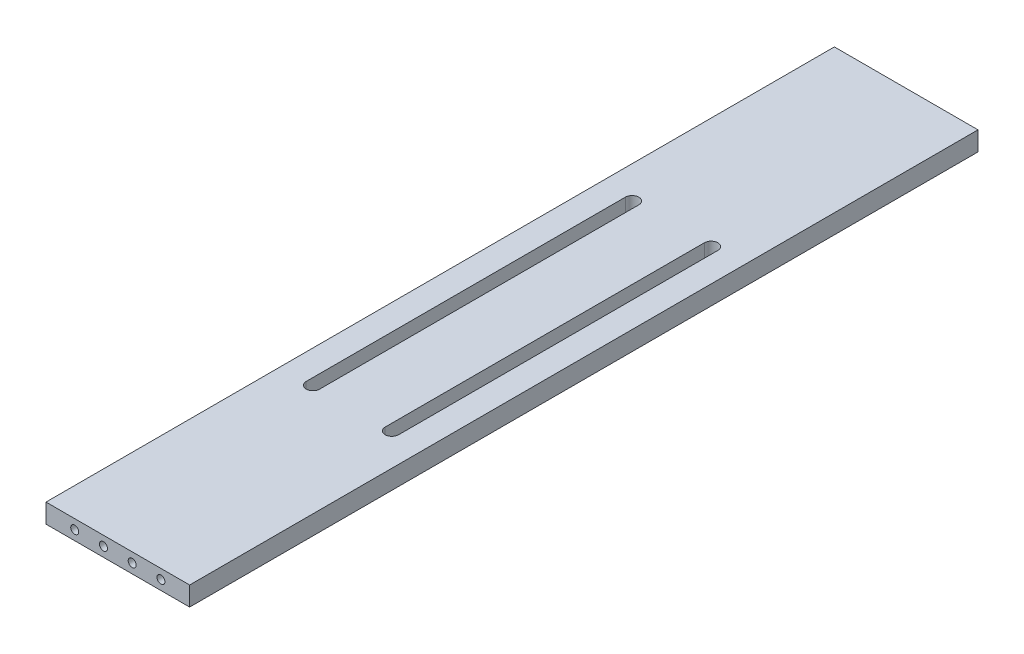
ISO-10303-21;
HEADER;
FILE_DESCRIPTION(('STEP AP214'),'2;1');
FILE_NAME('part.step','',(''),(''),'','','');
FILE_SCHEMA(('AUTOMOTIVE_DESIGN { 1 0 10303 214 1 1 1 1 }'));
ENDSEC;
DATA;
#1=APPLICATION_CONTEXT('core data for automotive mechanical design processes');
#2=APPLICATION_PROTOCOL_DEFINITION('international standard','automotive_design',2000,#1);
#3=PRODUCT_CONTEXT('',#1,'mechanical');
#4=PRODUCT('Part','Part','',(#3));
#5=PRODUCT_RELATED_PRODUCT_CATEGORY('part','',(#4));
#6=PRODUCT_DEFINITION_FORMATION('','',#4);
#7=PRODUCT_DEFINITION_CONTEXT('part definition',#1,'design');
#8=PRODUCT_DEFINITION('design','',#6,#7);
#9=PRODUCT_DEFINITION_SHAPE('','',#8);
#10=(LENGTH_UNIT() NAMED_UNIT(*) SI_UNIT(.MILLI.,.METRE.));
#11=(NAMED_UNIT(*) PLANE_ANGLE_UNIT() SI_UNIT($,.RADIAN.));
#12=(NAMED_UNIT(*) SI_UNIT($,.STERADIAN.) SOLID_ANGLE_UNIT());
#13=UNCERTAINTY_MEASURE_WITH_UNIT(LENGTH_MEASURE(1.E-05),#10,'distance_accuracy_value','');
#14=(GEOMETRIC_REPRESENTATION_CONTEXT(3) GLOBAL_UNCERTAINTY_ASSIGNED_CONTEXT((#13)) GLOBAL_UNIT_ASSIGNED_CONTEXT((#10,
#11,#12)) REPRESENTATION_CONTEXT('',''));
#15=CARTESIAN_POINT('',(0.,0.,0.));
#16=DIRECTION('',(0.,0.,1.));
#17=DIRECTION('',(1.,0.,0.));
#18=AXIS2_PLACEMENT_3D('',#15,#16,#17);
#19=CARTESIAN_POINT('',(-22.5,6.,0.));
#20=DIRECTION('',(0.,0.,1.));
#21=DIRECTION('',(1.,0.,0.));
#22=AXIS2_PLACEMENT_3D('',#19,#20,#21);
#23=PLANE('',#22);
#24=CARTESIAN_POINT('',(13.5000000000001,2.99999999999998,0.));
#25=DIRECTION('',(0.,0.,-1.));
#26=DIRECTION('',(-1.,0.,0.));
#27=AXIS2_PLACEMENT_3D('',#24,#25,#26);
#28=CIRCLE('',#27,1.24999999999999);
#29=CARTESIAN_POINT('',(12.2500000000001,2.99999999999998,0.));
#30=VERTEX_POINT('',#29);
#31=EDGE_CURVE('E162',#30,#30,#28,.T.);
#32=ORIENTED_EDGE('',*,*,#31,.F.);
#33=EDGE_LOOP('',(#32));
#34=FACE_BOUND('',#33,.T.);
#35=CARTESIAN_POINT('',(4.50000000000006,2.99999999999998,0.));
#36=DIRECTION('',(0.,0.,-1.));
#37=DIRECTION('',(-1.,0.,0.));
#38=AXIS2_PLACEMENT_3D('',#35,#36,#37);
#39=CIRCLE('',#38,1.24999999999999);
#40=CARTESIAN_POINT('',(3.25000000000007,2.99999999999998,0.));
#41=VERTEX_POINT('',#40);
#42=EDGE_CURVE('E161',#41,#41,#39,.T.);
#43=ORIENTED_EDGE('',*,*,#42,.F.);
#44=EDGE_LOOP('',(#43));
#45=FACE_BOUND('',#44,.T.);
#46=CARTESIAN_POINT('',(-4.49999999999993,2.99999999999999,0.));
#47=DIRECTION('',(0.,0.,-1.));
#48=DIRECTION('',(-1.,0.,0.));
#49=AXIS2_PLACEMENT_3D('',#46,#47,#48);
#50=CIRCLE('',#49,1.24999999999999);
#51=CARTESIAN_POINT('',(-5.74999999999992,2.99999999999999,0.));
#52=VERTEX_POINT('',#51);
#53=EDGE_CURVE('E172',#52,#52,#50,.T.);
#54=ORIENTED_EDGE('',*,*,#53,.F.);
#55=EDGE_LOOP('',(#54));
#56=FACE_BOUND('',#55,.T.);
#57=CARTESIAN_POINT('',(-13.4999999999999,3.,0.));
#58=DIRECTION('',(0.,0.,-1.));
#59=DIRECTION('',(-1.,0.,0.));
#60=AXIS2_PLACEMENT_3D('',#57,#58,#59);
#61=CIRCLE('',#60,1.24999999999999);
#62=CARTESIAN_POINT('',(-14.7499999999999,3.,0.));
#63=VERTEX_POINT('',#62);
#64=EDGE_CURVE('E178',#63,#63,#61,.T.);
#65=ORIENTED_EDGE('',*,*,#64,.F.);
#66=EDGE_LOOP('',(#65));
#67=FACE_BOUND('',#66,.T.);
#68=DIRECTION('',(-1.,0.,0.));
#69=VECTOR('',#68,1.);
#70=CARTESIAN_POINT('',(-22.5,0.,0.));
#71=LINE('',#70,#69);
#72=CARTESIAN_POINT('',(22.5,0.,0.));
#73=VERTEX_POINT('',#72);
#74=CARTESIAN_POINT('',(-22.5,0.,0.));
#75=VERTEX_POINT('',#74);
#76=EDGE_CURVE('E262',#73,#75,#71,.T.);
#77=ORIENTED_EDGE('',*,*,#76,.T.);
#78=DIRECTION('',(0.,-1.,0.));
#79=VECTOR('',#78,1.);
#80=CARTESIAN_POINT('',(-22.5,6.,0.));
#81=LINE('',#80,#79);
#82=CARTESIAN_POINT('',(-22.5,6.,0.));
#83=VERTEX_POINT('',#82);
#84=EDGE_CURVE('E11',#83,#75,#81,.T.);
#85=ORIENTED_EDGE('',*,*,#84,.F.);
#86=DIRECTION('',(-1.,0.,0.));
#87=VECTOR('',#86,1.);
#88=CARTESIAN_POINT('',(-22.5,6.,0.));
#89=LINE('',#88,#87);
#90=CARTESIAN_POINT('',(22.5,6.,0.));
#91=VERTEX_POINT('',#90);
#92=EDGE_CURVE('E269',#91,#83,#89,.T.);
#93=ORIENTED_EDGE('',*,*,#92,.F.);
#94=DIRECTION('',(0.,-1.,0.));
#95=VECTOR('',#94,1.);
#96=CARTESIAN_POINT('',(22.5,6.,0.));
#97=LINE('',#96,#95);
#98=EDGE_CURVE('E279',#91,#73,#97,.T.);
#99=ORIENTED_EDGE('',*,*,#98,.T.);
#100=EDGE_LOOP('',(#77,#85,#93,#99));
#101=FACE_BOUND('',#100,.T.);
#102=ADVANCED_FACE('F41',(#34,#45,#56,#67,#101),#23,.F.);
#103=CARTESIAN_POINT('',(-22.5,6.,0.));
#104=DIRECTION('',(1.,0.,0.));
#105=DIRECTION('',(0.,0.,-1.));
#106=AXIS2_PLACEMENT_3D('',#103,#104,#105);
#107=PLANE('',#106);
#108=DIRECTION('',(0.,0.,1.));
#109=VECTOR('',#108,1.);
#110=CARTESIAN_POINT('',(-22.5,0.,0.));
#111=LINE('',#110,#109);
#112=CARTESIAN_POINT('',(-22.5,0.,247.));
#113=VERTEX_POINT('',#112);
#114=EDGE_CURVE('E282',#75,#113,#111,.T.);
#115=ORIENTED_EDGE('',*,*,#114,.T.);
#116=DIRECTION('',(0.,-1.,0.));
#117=VECTOR('',#116,1.);
#118=CARTESIAN_POINT('',(-22.5,6.,247.));
#119=LINE('',#118,#117);
#120=CARTESIAN_POINT('',(-22.5,6.,247.));
#121=VERTEX_POINT('',#120);
#122=EDGE_CURVE('E48',#121,#113,#119,.T.);
#123=ORIENTED_EDGE('',*,*,#122,.F.);
#124=DIRECTION('',(0.,0.,1.));
#125=VECTOR('',#124,1.);
#126=CARTESIAN_POINT('',(-22.5,6.,0.));
#127=LINE('',#126,#125);
#128=EDGE_CURVE('E272',#83,#121,#127,.T.);
#129=ORIENTED_EDGE('',*,*,#128,.F.);
#130=ORIENTED_EDGE('',*,*,#84,.T.);
#131=EDGE_LOOP('',(#115,#123,#129,#130));
#132=FACE_BOUND('',#131,.T.);
#133=ADVANCED_FACE('F312',(#132),#107,.F.);
#134=CARTESIAN_POINT('',(-22.5,6.,247.));
#135=DIRECTION('',(0.,0.,-1.));
#136=DIRECTION('',(-1.,0.,0.));
#137=AXIS2_PLACEMENT_3D('',#134,#135,#136);
#138=PLANE('',#137);
#139=CARTESIAN_POINT('',(-13.5,3.,247.));
#140=DIRECTION('',(0.,0.,1.));
#141=DIRECTION('',(1.,0.,0.));
#142=AXIS2_PLACEMENT_3D('',#139,#140,#141);
#143=CIRCLE('',#142,1.24999999999999);
#144=CARTESIAN_POINT('',(-12.25,3.,247.));
#145=VERTEX_POINT('',#144);
#146=EDGE_CURVE('E184',#145,#145,#143,.T.);
#147=ORIENTED_EDGE('',*,*,#146,.F.);
#148=EDGE_LOOP('',(#147));
#149=FACE_BOUND('',#148,.T.);
#150=CARTESIAN_POINT('',(-4.49999999999996,2.99999999999999,247.));
#151=DIRECTION('',(0.,0.,1.));
#152=DIRECTION('',(1.,0.,0.));
#153=AXIS2_PLACEMENT_3D('',#150,#151,#152);
#154=CIRCLE('',#153,1.24999999999999);
#155=CARTESIAN_POINT('',(-3.24999999999997,2.99999999999999,247.));
#156=VERTEX_POINT('',#155);
#157=EDGE_CURVE('E190',#156,#156,#154,.T.);
#158=ORIENTED_EDGE('',*,*,#157,.F.);
#159=EDGE_LOOP('',(#158));
#160=FACE_BOUND('',#159,.T.);
#161=CARTESIAN_POINT('',(4.50000000000003,2.99999999999998,247.));
#162=DIRECTION('',(0.,0.,1.));
#163=DIRECTION('',(1.,0.,0.));
#164=AXIS2_PLACEMENT_3D('',#161,#162,#163);
#165=CIRCLE('',#164,1.24999999999999);
#166=CARTESIAN_POINT('',(5.75000000000002,2.99999999999998,247.));
#167=VERTEX_POINT('',#166);
#168=EDGE_CURVE('E196',#167,#167,#165,.T.);
#169=ORIENTED_EDGE('',*,*,#168,.F.);
#170=EDGE_LOOP('',(#169));
#171=FACE_BOUND('',#170,.T.);
#172=CARTESIAN_POINT('',(13.5,2.99999999999998,247.));
#173=DIRECTION('',(0.,0.,1.));
#174=DIRECTION('',(1.,0.,0.));
#175=AXIS2_PLACEMENT_3D('',#172,#173,#174);
#176=CIRCLE('',#175,1.24999999999999);
#177=CARTESIAN_POINT('',(14.75,2.99999999999998,247.));
#178=VERTEX_POINT('',#177);
#179=EDGE_CURVE('E202',#178,#178,#176,.T.);
#180=ORIENTED_EDGE('',*,*,#179,.F.);
#181=EDGE_LOOP('',(#180));
#182=FACE_BOUND('',#181,.T.);
#183=DIRECTION('',(1.,0.,0.));
#184=VECTOR('',#183,1.);
#185=CARTESIAN_POINT('',(-22.5,0.,247.));
#186=LINE('',#185,#184);
#187=CARTESIAN_POINT('',(22.5,0.,247.));
#188=VERTEX_POINT('',#187);
#189=EDGE_CURVE('E284',#113,#188,#186,.T.);
#190=ORIENTED_EDGE('',*,*,#189,.T.);
#191=DIRECTION('',(0.,-1.,0.));
#192=VECTOR('',#191,1.);
#193=CARTESIAN_POINT('',(22.5,6.,247.));
#194=LINE('',#193,#192);
#195=CARTESIAN_POINT('',(22.5,6.,247.));
#196=VERTEX_POINT('',#195);
#197=EDGE_CURVE('E289',#196,#188,#194,.T.);
#198=ORIENTED_EDGE('',*,*,#197,.F.);
#199=DIRECTION('',(1.,0.,0.));
#200=VECTOR('',#199,1.);
#201=CARTESIAN_POINT('',(-22.5,6.,247.));
#202=LINE('',#201,#200);
#203=EDGE_CURVE('E275',#121,#196,#202,.T.);
#204=ORIENTED_EDGE('',*,*,#203,.F.);
#205=ORIENTED_EDGE('',*,*,#122,.T.);
#206=EDGE_LOOP('',(#190,#198,#204,#205));
#207=FACE_BOUND('',#206,.T.);
#208=ADVANCED_FACE('F296',(#149,#160,#171,#182,#207),#138,.F.);
#209=CARTESIAN_POINT('',(22.5,6.,0.));
#210=DIRECTION('',(-1.,0.,0.));
#211=DIRECTION('',(0.,0.,1.));
#212=AXIS2_PLACEMENT_3D('',#209,#210,#211);
#213=PLANE('',#212);
#214=DIRECTION('',(0.,0.,-1.));
#215=VECTOR('',#214,1.);
#216=CARTESIAN_POINT('',(22.5,0.,0.));
#217=LINE('',#216,#215);
#218=EDGE_CURVE('E273',#188,#73,#217,.T.);
#219=ORIENTED_EDGE('',*,*,#218,.T.);
#220=ORIENTED_EDGE('',*,*,#98,.F.);
#221=DIRECTION('',(0.,0.,-1.));
#222=VECTOR('',#221,1.);
#223=CARTESIAN_POINT('',(22.5,6.,0.));
#224=LINE('',#223,#222);
#225=EDGE_CURVE('E277',#196,#91,#224,.T.);
#226=ORIENTED_EDGE('',*,*,#225,.F.);
#227=ORIENTED_EDGE('',*,*,#197,.T.);
#228=EDGE_LOOP('',(#219,#220,#226,#227));
#229=FACE_BOUND('',#228,.T.);
#230=ADVANCED_FACE('F305',(#229),#213,.F.);
#231=CARTESIAN_POINT('',(0.,6.,0.));
#232=DIRECTION('',(0.,-1.,0.));
#233=DIRECTION('',(0.,0.,-1.));
#234=AXIS2_PLACEMENT_3D('',#231,#232,#233);
#235=PLANE('',#234);
#236=DIRECTION('',(0.,0.,1.));
#237=VECTOR('',#236,1.);
#238=CARTESIAN_POINT('',(-14.4743686707646,6.,73.5));
#239=LINE('',#238,#237);
#240=CARTESIAN_POINT('',(-14.4743686707646,6.,73.5));
#241=VERTEX_POINT('',#240);
#242=CARTESIAN_POINT('',(-14.4743686707646,6.,173.5));
#243=VERTEX_POINT('',#242);
#244=EDGE_CURVE('E221',#241,#243,#239,.T.);
#245=ORIENTED_EDGE('',*,*,#244,.F.);
#246=CARTESIAN_POINT('',(-12.3743686707645,6.,73.5));
#247=DIRECTION('',(0.,1.,0.));
#248=DIRECTION('',(0.,0.,1.));
#249=AXIS2_PLACEMENT_3D('',#246,#247,#248);
#250=CIRCLE('',#249,2.10000000000002);
#251=CARTESIAN_POINT('',(-10.2743686707645,6.,73.5));
#252=VERTEX_POINT('',#251);
#253=EDGE_CURVE('E55',#252,#241,#250,.T.);
#254=ORIENTED_EDGE('',*,*,#253,.F.);
#255=DIRECTION('',(0.,0.,-1.));
#256=VECTOR('',#255,1.);
#257=CARTESIAN_POINT('',(-10.2743686707645,6.,73.5));
#258=LINE('',#257,#256);
#259=CARTESIAN_POINT('',(-10.2743686707645,6.,173.5));
#260=VERTEX_POINT('',#259);
#261=EDGE_CURVE('E212',#260,#252,#258,.T.);
#262=ORIENTED_EDGE('',*,*,#261,.F.);
#263=CARTESIAN_POINT('',(-12.3743686707645,6.,173.5));
#264=DIRECTION('',(0.,1.,0.));
#265=DIRECTION('',(0.,0.,1.));
#266=AXIS2_PLACEMENT_3D('',#263,#264,#265);
#267=CIRCLE('',#266,2.10000000000002);
#268=EDGE_CURVE('E224',#243,#260,#267,.T.);
#269=ORIENTED_EDGE('',*,*,#268,.F.);
#270=EDGE_LOOP('',(#245,#254,#262,#269));
#271=FACE_BOUND('',#270,.T.);
#272=DIRECTION('',(0.,0.,1.));
#273=VECTOR('',#272,1.);
#274=CARTESIAN_POINT('',(10.2743686707645,6.,73.5));
#275=LINE('',#274,#273);
#276=CARTESIAN_POINT('',(10.2743686707645,6.,73.5));
#277=VERTEX_POINT('',#276);
#278=CARTESIAN_POINT('',(10.2743686707646,6.,173.5));
#279=VERTEX_POINT('',#278);
#280=EDGE_CURVE('E252',#277,#279,#275,.T.);
#281=ORIENTED_EDGE('',*,*,#280,.F.);
#282=CARTESIAN_POINT('',(12.3743686707646,6.,73.5));
#283=DIRECTION('',(0.,1.,0.));
#284=DIRECTION('',(0.,0.,-1.));
#285=AXIS2_PLACEMENT_3D('',#282,#283,#284);
#286=CIRCLE('',#285,2.10000000000002);
#287=CARTESIAN_POINT('',(14.4743686707646,6.,73.5));
#288=VERTEX_POINT('',#287);
#289=EDGE_CURVE('E231',#288,#277,#286,.T.);
#290=ORIENTED_EDGE('',*,*,#289,.F.);
#291=DIRECTION('',(0.,0.,-1.));
#292=VECTOR('',#291,1.);
#293=CARTESIAN_POINT('',(14.4743686707646,6.,73.5));
#294=LINE('',#293,#292);
#295=CARTESIAN_POINT('',(14.4743686707646,6.,173.5));
#296=VERTEX_POINT('',#295);
#297=EDGE_CURVE('E241',#296,#288,#294,.T.);
#298=ORIENTED_EDGE('',*,*,#297,.F.);
#299=CARTESIAN_POINT('',(12.3743686707646,6.,173.5));
#300=DIRECTION('',(0.,1.,0.));
#301=DIRECTION('',(0.,0.,-1.));
#302=AXIS2_PLACEMENT_3D('',#299,#300,#301);
#303=CIRCLE('',#302,2.10000000000002);
#304=EDGE_CURVE('E255',#279,#296,#303,.T.);
#305=ORIENTED_EDGE('',*,*,#304,.F.);
#306=EDGE_LOOP('',(#281,#290,#298,#305));
#307=FACE_BOUND('',#306,.T.);
#308=ORIENTED_EDGE('',*,*,#92,.T.);
#309=ORIENTED_EDGE('',*,*,#128,.T.);
#310=ORIENTED_EDGE('',*,*,#203,.T.);
#311=ORIENTED_EDGE('',*,*,#225,.T.);
#312=EDGE_LOOP('',(#308,#309,#310,#311));
#313=FACE_BOUND('',#312,.T.);
#314=ADVANCED_FACE('F311',(#271,#307,#313),#235,.F.);
#315=CARTESIAN_POINT('',(0.,0.,0.));
#316=DIRECTION('',(0.,-1.,0.));
#317=DIRECTION('',(0.,0.,-1.));
#318=AXIS2_PLACEMENT_3D('',#315,#316,#317);
#319=PLANE('',#318);
#320=CARTESIAN_POINT('',(-12.3743686707645,0.,73.5));
#321=DIRECTION('',(0.,1.,0.));
#322=DIRECTION('',(0.,0.,1.));
#323=AXIS2_PLACEMENT_3D('',#320,#321,#322);
#324=CIRCLE('',#323,2.10000000000002);
#325=CARTESIAN_POINT('',(-10.2743686707645,0.,73.5));
#326=VERTEX_POINT('',#325);
#327=CARTESIAN_POINT('',(-14.4743686707646,0.,73.5));
#328=VERTEX_POINT('',#327);
#329=EDGE_CURVE('E208',#326,#328,#324,.T.);
#330=ORIENTED_EDGE('',*,*,#329,.T.);
#331=DIRECTION('',(0.,0.,1.));
#332=VECTOR('',#331,1.);
#333=CARTESIAN_POINT('',(-14.4743686707646,0.,73.5));
#334=LINE('',#333,#332);
#335=CARTESIAN_POINT('',(-14.4743686707646,0.,173.5));
#336=VERTEX_POINT('',#335);
#337=EDGE_CURVE('E211',#328,#336,#334,.T.);
#338=ORIENTED_EDGE('',*,*,#337,.T.);
#339=CARTESIAN_POINT('',(-12.3743686707645,0.,173.5));
#340=DIRECTION('',(0.,1.,0.));
#341=DIRECTION('',(0.,0.,1.));
#342=AXIS2_PLACEMENT_3D('',#339,#340,#341);
#343=CIRCLE('',#342,2.10000000000002);
#344=CARTESIAN_POINT('',(-10.2743686707645,0.,173.5));
#345=VERTEX_POINT('',#344);
#346=EDGE_CURVE('E63',#336,#345,#343,.T.);
#347=ORIENTED_EDGE('',*,*,#346,.T.);
#348=DIRECTION('',(0.,0.,-1.));
#349=VECTOR('',#348,1.);
#350=CARTESIAN_POINT('',(-10.2743686707645,0.,73.5));
#351=LINE('',#350,#349);
#352=EDGE_CURVE('E216',#345,#326,#351,.T.);
#353=ORIENTED_EDGE('',*,*,#352,.T.);
#354=EDGE_LOOP('',(#330,#338,#347,#353));
#355=FACE_BOUND('',#354,.T.);
#356=CARTESIAN_POINT('',(12.3743686707646,0.,73.5));
#357=DIRECTION('',(0.,1.,0.));
#358=DIRECTION('',(0.,0.,-1.));
#359=AXIS2_PLACEMENT_3D('',#356,#357,#358);
#360=CIRCLE('',#359,2.10000000000002);
#361=CARTESIAN_POINT('',(14.4743686707646,0.,73.5));
#362=VERTEX_POINT('',#361);
#363=CARTESIAN_POINT('',(10.2743686707645,0.,73.5));
#364=VERTEX_POINT('',#363);
#365=EDGE_CURVE('E237',#362,#364,#360,.T.);
#366=ORIENTED_EDGE('',*,*,#365,.T.);
#367=DIRECTION('',(0.,0.,1.));
#368=VECTOR('',#367,1.);
#369=CARTESIAN_POINT('',(10.2743686707645,0.,73.5));
#370=LINE('',#369,#368);
#371=CARTESIAN_POINT('',(10.2743686707646,0.,173.5));
#372=VERTEX_POINT('',#371);
#373=EDGE_CURVE('E240',#364,#372,#370,.T.);
#374=ORIENTED_EDGE('',*,*,#373,.T.);
#375=CARTESIAN_POINT('',(12.3743686707646,0.,173.5));
#376=DIRECTION('',(0.,1.,0.));
#377=DIRECTION('',(0.,0.,-1.));
#378=AXIS2_PLACEMENT_3D('',#375,#376,#377);
#379=CIRCLE('',#378,2.10000000000002);
#380=CARTESIAN_POINT('',(14.4743686707646,0.,173.5));
#381=VERTEX_POINT('',#380);
#382=EDGE_CURVE('E244',#372,#381,#379,.T.);
#383=ORIENTED_EDGE('',*,*,#382,.T.);
#384=DIRECTION('',(0.,0.,-1.));
#385=VECTOR('',#384,1.);
#386=CARTESIAN_POINT('',(14.4743686707646,0.,73.5));
#387=LINE('',#386,#385);
#388=EDGE_CURVE('E247',#381,#362,#387,.T.);
#389=ORIENTED_EDGE('',*,*,#388,.T.);
#390=EDGE_LOOP('',(#366,#374,#383,#389));
#391=FACE_BOUND('',#390,.T.);
#392=ORIENTED_EDGE('',*,*,#76,.F.);
#393=ORIENTED_EDGE('',*,*,#218,.F.);
#394=ORIENTED_EDGE('',*,*,#189,.F.);
#395=ORIENTED_EDGE('',*,*,#114,.F.);
#396=EDGE_LOOP('',(#392,#393,#394,#395));
#397=FACE_BOUND('',#396,.T.);
#398=ADVANCED_FACE('F302',(#355,#391,#397),#319,.T.);
#399=CARTESIAN_POINT('',(12.3743686707646,0.,73.5));
#400=DIRECTION('',(0.,1.,0.));
#401=DIRECTION('',(0.,0.,1.));
#402=AXIS2_PLACEMENT_3D('',#399,#400,#401);
#403=CYLINDRICAL_SURFACE('',#402,2.10000000000002);
#404=ORIENTED_EDGE('',*,*,#289,.T.);
#405=DIRECTION('',(0.,1.,0.));
#406=VECTOR('',#405,1.);
#407=CARTESIAN_POINT('',(10.2743686707645,0.,73.5));
#408=LINE('',#407,#406);
#409=EDGE_CURVE('E250',#364,#277,#408,.T.);
#410=ORIENTED_EDGE('',*,*,#409,.F.);
#411=ORIENTED_EDGE('',*,*,#365,.F.);
#412=DIRECTION('',(0.,1.,0.));
#413=VECTOR('',#412,1.);
#414=CARTESIAN_POINT('',(14.4743686707646,0.,73.5));
#415=LINE('',#414,#413);
#416=EDGE_CURVE('E260',#362,#288,#415,.T.);
#417=ORIENTED_EDGE('',*,*,#416,.T.);
#418=EDGE_LOOP('',(#404,#410,#411,#417));
#419=FACE_BOUND('',#418,.T.);
#420=ADVANCED_FACE('F326',(#419),#403,.F.);
#421=CARTESIAN_POINT('',(14.4743686707646,0.,73.5));
#422=DIRECTION('',(1.,0.,0.));
#423=DIRECTION('',(0.,0.,-1.));
#424=AXIS2_PLACEMENT_3D('',#421,#422,#423);
#425=PLANE('',#424);
#426=ORIENTED_EDGE('',*,*,#297,.T.);
#427=ORIENTED_EDGE('',*,*,#416,.F.);
#428=ORIENTED_EDGE('',*,*,#388,.F.);
#429=DIRECTION('',(0.,1.,0.));
#430=VECTOR('',#429,1.);
#431=CARTESIAN_POINT('',(14.4743686707646,0.,173.5));
#432=LINE('',#431,#430);
#433=EDGE_CURVE('E263',#381,#296,#432,.T.);
#434=ORIENTED_EDGE('',*,*,#433,.T.);
#435=EDGE_LOOP('',(#426,#427,#428,#434));
#436=FACE_BOUND('',#435,.T.);
#437=ADVANCED_FACE('F333',(#436),#425,.F.);
#438=CARTESIAN_POINT('',(12.3743686707646,0.,173.5));
#439=DIRECTION('',(0.,1.,0.));
#440=DIRECTION('',(0.,0.,1.));
#441=AXIS2_PLACEMENT_3D('',#438,#439,#440);
#442=CYLINDRICAL_SURFACE('',#441,2.10000000000002);
#443=ORIENTED_EDGE('',*,*,#304,.T.);
#444=ORIENTED_EDGE('',*,*,#433,.F.);
#445=ORIENTED_EDGE('',*,*,#382,.F.);
#446=DIRECTION('',(0.,1.,0.));
#447=VECTOR('',#446,1.);
#448=CARTESIAN_POINT('',(10.2743686707646,0.,173.5));
#449=LINE('',#448,#447);
#450=EDGE_CURVE('E265',#372,#279,#449,.T.);
#451=ORIENTED_EDGE('',*,*,#450,.T.);
#452=EDGE_LOOP('',(#443,#444,#445,#451));
#453=FACE_BOUND('',#452,.T.);
#454=ADVANCED_FACE('F339',(#453),#442,.F.);
#455=CARTESIAN_POINT('',(10.2743686707645,0.,73.5));
#456=DIRECTION('',(-1.,0.,0.));
#457=DIRECTION('',(0.,0.,1.));
#458=AXIS2_PLACEMENT_3D('',#455,#456,#457);
#459=PLANE('',#458);
#460=ORIENTED_EDGE('',*,*,#280,.T.);
#461=ORIENTED_EDGE('',*,*,#450,.F.);
#462=ORIENTED_EDGE('',*,*,#373,.F.);
#463=ORIENTED_EDGE('',*,*,#409,.T.);
#464=EDGE_LOOP('',(#460,#461,#462,#463));
#465=FACE_BOUND('',#464,.T.);
#466=ADVANCED_FACE('F335',(#465),#459,.F.);
#467=CARTESIAN_POINT('',(-12.3743686707645,0.,73.5));
#468=DIRECTION('',(0.,1.,0.));
#469=DIRECTION('',(0.,0.,1.));
#470=AXIS2_PLACEMENT_3D('',#467,#468,#469);
#471=CYLINDRICAL_SURFACE('',#470,2.10000000000002);
#472=ORIENTED_EDGE('',*,*,#253,.T.);
#473=DIRECTION('',(0.,1.,0.));
#474=VECTOR('',#473,1.);
#475=CARTESIAN_POINT('',(-14.4743686707646,0.,73.5));
#476=LINE('',#475,#474);
#477=EDGE_CURVE('E219',#328,#241,#476,.T.);
#478=ORIENTED_EDGE('',*,*,#477,.F.);
#479=ORIENTED_EDGE('',*,*,#329,.F.);
#480=DIRECTION('',(0.,1.,0.));
#481=VECTOR('',#480,1.);
#482=CARTESIAN_POINT('',(-10.2743686707645,0.,73.5));
#483=LINE('',#482,#481);
#484=EDGE_CURVE('E229',#326,#252,#483,.T.);
#485=ORIENTED_EDGE('',*,*,#484,.T.);
#486=EDGE_LOOP('',(#472,#478,#479,#485));
#487=FACE_BOUND('',#486,.T.);
#488=ADVANCED_FACE('F338',(#487),#471,.F.);
#489=CARTESIAN_POINT('',(-10.2743686707645,0.,73.5));
#490=DIRECTION('',(1.,0.,0.));
#491=DIRECTION('',(0.,0.,-1.));
#492=AXIS2_PLACEMENT_3D('',#489,#490,#491);
#493=PLANE('',#492);
#494=ORIENTED_EDGE('',*,*,#261,.T.);
#495=ORIENTED_EDGE('',*,*,#484,.F.);
#496=ORIENTED_EDGE('',*,*,#352,.F.);
#497=DIRECTION('',(0.,1.,0.));
#498=VECTOR('',#497,1.);
#499=CARTESIAN_POINT('',(-10.2743686707645,0.,173.5));
#500=LINE('',#499,#498);
#501=EDGE_CURVE('E232',#345,#260,#500,.T.);
#502=ORIENTED_EDGE('',*,*,#501,.T.);
#503=EDGE_LOOP('',(#494,#495,#496,#502));
#504=FACE_BOUND('',#503,.T.);
#505=ADVANCED_FACE('F349',(#504),#493,.F.);
#506=CARTESIAN_POINT('',(-12.3743686707645,0.,173.5));
#507=DIRECTION('',(0.,1.,0.));
#508=DIRECTION('',(0.,0.,1.));
#509=AXIS2_PLACEMENT_3D('',#506,#507,#508);
#510=CYLINDRICAL_SURFACE('',#509,2.10000000000002);
#511=ORIENTED_EDGE('',*,*,#268,.T.);
#512=ORIENTED_EDGE('',*,*,#501,.F.);
#513=ORIENTED_EDGE('',*,*,#346,.F.);
#514=DIRECTION('',(0.,1.,0.));
#515=VECTOR('',#514,1.);
#516=CARTESIAN_POINT('',(-14.4743686707646,0.,173.5));
#517=LINE('',#516,#515);
#518=EDGE_CURVE('E234',#336,#243,#517,.T.);
#519=ORIENTED_EDGE('',*,*,#518,.T.);
#520=EDGE_LOOP('',(#511,#512,#513,#519));
#521=FACE_BOUND('',#520,.T.);
#522=ADVANCED_FACE('F354',(#521),#510,.F.);
#523=CARTESIAN_POINT('',(-14.4743686707646,0.,73.5));
#524=DIRECTION('',(-1.,0.,0.));
#525=DIRECTION('',(0.,0.,1.));
#526=AXIS2_PLACEMENT_3D('',#523,#524,#525);
#527=PLANE('',#526);
#528=ORIENTED_EDGE('',*,*,#244,.T.);
#529=ORIENTED_EDGE('',*,*,#518,.F.);
#530=ORIENTED_EDGE('',*,*,#337,.F.);
#531=ORIENTED_EDGE('',*,*,#477,.T.);
#532=EDGE_LOOP('',(#528,#529,#530,#531));
#533=FACE_BOUND('',#532,.T.);
#534=ADVANCED_FACE('F350',(#533),#527,.F.);
#535=CARTESIAN_POINT('',(13.5,2.99999999999998,238.5));
#536=DIRECTION('',(0.,0.,1.));
#537=DIRECTION('',(1.,0.,0.));
#538=AXIS2_PLACEMENT_3D('',#535,#536,#537);
#539=CONICAL_SURFACE('',#538,1.24999999999999,1.02974425867665);
#540=CARTESIAN_POINT('',(13.5,2.99999999999998,237.748924226216));
#541=VERTEX_POINT('',#540);
#542=VERTEX_LOOP('',#541);
#543=FACE_BOUND('',#542,.T.);
#544=CARTESIAN_POINT('',(13.5,2.99999999999998,238.5));
#545=DIRECTION('',(0.,0.,1.));
#546=DIRECTION('',(1.,0.,0.));
#547=AXIS2_PLACEMENT_3D('',#544,#545,#546);
#548=CIRCLE('',#547,1.24999999999999);
#549=CARTESIAN_POINT('',(14.75,2.99999999999998,238.5));
#550=VERTEX_POINT('',#549);
#551=EDGE_CURVE('E205',#550,#550,#548,.T.);
#552=ORIENTED_EDGE('',*,*,#551,.T.);
#553=EDGE_LOOP('',(#552));
#554=FACE_BOUND('',#553,.T.);
#555=ADVANCED_FACE('F353',(#543,#554),#539,.F.);
#556=CARTESIAN_POINT('',(13.5,2.99999999999998,247.));
#557=DIRECTION('',(0.,0.,1.));
#558=DIRECTION('',(1.,0.,0.));
#559=AXIS2_PLACEMENT_3D('',#556,#557,#558);
#560=CYLINDRICAL_SURFACE('',#559,1.24999999999999);
#561=ORIENTED_EDGE('',*,*,#551,.F.);
#562=EDGE_LOOP('',(#561));
#563=FACE_BOUND('',#562,.T.);
#564=ORIENTED_EDGE('',*,*,#179,.T.);
#565=EDGE_LOOP('',(#564));
#566=FACE_BOUND('',#565,.T.);
#567=ADVANCED_FACE('F363',(#563,#566),#560,.F.);
#568=CARTESIAN_POINT('',(4.50000000000003,2.99999999999998,238.5));
#569=DIRECTION('',(0.,0.,1.));
#570=DIRECTION('',(1.,0.,0.));
#571=AXIS2_PLACEMENT_3D('',#568,#569,#570);
#572=CONICAL_SURFACE('',#571,1.24999999999999,1.02974425867665);
#573=CARTESIAN_POINT('',(4.50000000000003,2.99999999999998,237.748924226216));
#574=VERTEX_POINT('',#573);
#575=VERTEX_LOOP('',#574);
#576=FACE_BOUND('',#575,.T.);
#577=CARTESIAN_POINT('',(4.50000000000003,2.99999999999998,238.5));
#578=DIRECTION('',(0.,0.,1.));
#579=DIRECTION('',(1.,0.,0.));
#580=AXIS2_PLACEMENT_3D('',#577,#578,#579);
#581=CIRCLE('',#580,1.24999999999999);
#582=CARTESIAN_POINT('',(5.75000000000002,2.99999999999998,238.5));
#583=VERTEX_POINT('',#582);
#584=EDGE_CURVE('E199',#583,#583,#581,.T.);
#585=ORIENTED_EDGE('',*,*,#584,.T.);
#586=EDGE_LOOP('',(#585));
#587=FACE_BOUND('',#586,.T.);
#588=ADVANCED_FACE('F367',(#576,#587),#572,.F.);
#589=CARTESIAN_POINT('',(4.50000000000003,2.99999999999998,247.));
#590=DIRECTION('',(0.,0.,1.));
#591=DIRECTION('',(1.,0.,0.));
#592=AXIS2_PLACEMENT_3D('',#589,#590,#591);
#593=CYLINDRICAL_SURFACE('',#592,1.24999999999999);
#594=ORIENTED_EDGE('',*,*,#584,.F.);
#595=EDGE_LOOP('',(#594));
#596=FACE_BOUND('',#595,.T.);
#597=ORIENTED_EDGE('',*,*,#168,.T.);
#598=EDGE_LOOP('',(#597));
#599=FACE_BOUND('',#598,.T.);
#600=ADVANCED_FACE('F371',(#596,#599),#593,.F.);
#601=CARTESIAN_POINT('',(-4.49999999999996,2.99999999999999,238.5));
#602=DIRECTION('',(0.,0.,1.));
#603=DIRECTION('',(1.,0.,0.));
#604=AXIS2_PLACEMENT_3D('',#601,#602,#603);
#605=CONICAL_SURFACE('',#604,1.24999999999999,1.02974425867665);
#606=CARTESIAN_POINT('',(-4.49999999999997,2.99999999999999,237.748924226216));
#607=VERTEX_POINT('',#606);
#608=VERTEX_LOOP('',#607);
#609=FACE_BOUND('',#608,.T.);
#610=CARTESIAN_POINT('',(-4.49999999999996,2.99999999999999,238.5));
#611=DIRECTION('',(0.,0.,1.));
#612=DIRECTION('',(1.,0.,0.));
#613=AXIS2_PLACEMENT_3D('',#610,#611,#612);
#614=CIRCLE('',#613,1.24999999999999);
#615=CARTESIAN_POINT('',(-3.24999999999998,2.99999999999999,238.5));
#616=VERTEX_POINT('',#615);
#617=EDGE_CURVE('E193',#616,#616,#614,.T.);
#618=ORIENTED_EDGE('',*,*,#617,.T.);
#619=EDGE_LOOP('',(#618));
#620=FACE_BOUND('',#619,.T.);
#621=ADVANCED_FACE('F375',(#609,#620),#605,.F.);
#622=CARTESIAN_POINT('',(-4.49999999999996,2.99999999999999,247.));
#623=DIRECTION('',(0.,0.,1.));
#624=DIRECTION('',(1.,0.,0.));
#625=AXIS2_PLACEMENT_3D('',#622,#623,#624);
#626=CYLINDRICAL_SURFACE('',#625,1.24999999999999);
#627=ORIENTED_EDGE('',*,*,#617,.F.);
#628=EDGE_LOOP('',(#627));
#629=FACE_BOUND('',#628,.T.);
#630=ORIENTED_EDGE('',*,*,#157,.T.);
#631=EDGE_LOOP('',(#630));
#632=FACE_BOUND('',#631,.T.);
#633=ADVANCED_FACE('F379',(#629,#632),#626,.F.);
#634=CARTESIAN_POINT('',(-13.5,3.,238.5));
#635=DIRECTION('',(0.,0.,1.));
#636=DIRECTION('',(1.,0.,0.));
#637=AXIS2_PLACEMENT_3D('',#634,#635,#636);
#638=CONICAL_SURFACE('',#637,1.24999999999999,1.02974425867665);
#639=CARTESIAN_POINT('',(-13.5,3.,237.748924226216));
#640=VERTEX_POINT('',#639);
#641=VERTEX_LOOP('',#640);
#642=FACE_BOUND('',#641,.T.);
#643=CARTESIAN_POINT('',(-13.5,3.,238.5));
#644=DIRECTION('',(0.,0.,1.));
#645=DIRECTION('',(1.,0.,0.));
#646=AXIS2_PLACEMENT_3D('',#643,#644,#645);
#647=CIRCLE('',#646,1.24999999999999);
#648=CARTESIAN_POINT('',(-12.25,3.,238.5));
#649=VERTEX_POINT('',#648);
#650=EDGE_CURVE('E187',#649,#649,#647,.T.);
#651=ORIENTED_EDGE('',*,*,#650,.T.);
#652=EDGE_LOOP('',(#651));
#653=FACE_BOUND('',#652,.T.);
#654=ADVANCED_FACE('F383',(#642,#653),#638,.F.);
#655=CARTESIAN_POINT('',(-13.5,3.,247.));
#656=DIRECTION('',(0.,0.,1.));
#657=DIRECTION('',(1.,0.,0.));
#658=AXIS2_PLACEMENT_3D('',#655,#656,#657);
#659=CYLINDRICAL_SURFACE('',#658,1.24999999999999);
#660=ORIENTED_EDGE('',*,*,#650,.F.);
#661=EDGE_LOOP('',(#660));
#662=FACE_BOUND('',#661,.T.);
#663=ORIENTED_EDGE('',*,*,#146,.T.);
#664=EDGE_LOOP('',(#663));
#665=FACE_BOUND('',#664,.T.);
#666=ADVANCED_FACE('F387',(#662,#665),#659,.F.);
#667=CARTESIAN_POINT('',(-13.4999999999999,3.,8.49999999999999));
#668=DIRECTION('',(0.,0.,-1.));
#669=DIRECTION('',(-1.,0.,0.));
#670=AXIS2_PLACEMENT_3D('',#667,#668,#669);
#671=CONICAL_SURFACE('',#670,1.24999999999999,1.02974425867665);
#672=CARTESIAN_POINT('',(-13.4999999999999,3.,9.25107577378444));
#673=VERTEX_POINT('',#672);
#674=VERTEX_LOOP('',#673);
#675=FACE_BOUND('',#674,.T.);
#676=CARTESIAN_POINT('',(-13.4999999999999,3.,8.49999999999999));
#677=DIRECTION('',(0.,0.,-1.));
#678=DIRECTION('',(-1.,0.,0.));
#679=AXIS2_PLACEMENT_3D('',#676,#677,#678);
#680=CIRCLE('',#679,1.24999999999999);
#681=CARTESIAN_POINT('',(-14.7499999999999,3.,8.49999999999999));
#682=VERTEX_POINT('',#681);
#683=EDGE_CURVE('E181',#682,#682,#680,.T.);
#684=ORIENTED_EDGE('',*,*,#683,.T.);
#685=EDGE_LOOP('',(#684));
#686=FACE_BOUND('',#685,.T.);
#687=ADVANCED_FACE('F391',(#675,#686),#671,.F.);
#688=CARTESIAN_POINT('',(-13.4999999999999,3.,0.));
#689=DIRECTION('',(0.,0.,-1.));
#690=DIRECTION('',(-1.,0.,0.));
#691=AXIS2_PLACEMENT_3D('',#688,#689,#690);
#692=CYLINDRICAL_SURFACE('',#691,1.24999999999999);
#693=ORIENTED_EDGE('',*,*,#683,.F.);
#694=EDGE_LOOP('',(#693));
#695=FACE_BOUND('',#694,.T.);
#696=ORIENTED_EDGE('',*,*,#64,.T.);
#697=EDGE_LOOP('',(#696));
#698=FACE_BOUND('',#697,.T.);
#699=ADVANCED_FACE('F395',(#695,#698),#692,.F.);
#700=CARTESIAN_POINT('',(-4.49999999999993,2.99999999999999,8.49999999999999));
#701=DIRECTION('',(0.,0.,-1.));
#702=DIRECTION('',(-1.,0.,0.));
#703=AXIS2_PLACEMENT_3D('',#700,#701,#702);
#704=CONICAL_SURFACE('',#703,1.24999999999999,1.02974425867665);
#705=CARTESIAN_POINT('',(-4.49999999999994,2.99999999999999,9.25107577378444));
#706=VERTEX_POINT('',#705);
#707=VERTEX_LOOP('',#706);
#708=FACE_BOUND('',#707,.T.);
#709=CARTESIAN_POINT('',(-4.49999999999993,2.99999999999999,8.49999999999999));
#710=DIRECTION('',(0.,0.,-1.));
#711=DIRECTION('',(-1.,0.,0.));
#712=AXIS2_PLACEMENT_3D('',#709,#710,#711);
#713=CIRCLE('',#712,1.24999999999999);
#714=CARTESIAN_POINT('',(-5.74999999999992,2.99999999999999,8.49999999999999));
#715=VERTEX_POINT('',#714);
#716=EDGE_CURVE('E175',#715,#715,#713,.T.);
#717=ORIENTED_EDGE('',*,*,#716,.T.);
#718=EDGE_LOOP('',(#717));
#719=FACE_BOUND('',#718,.T.);
#720=ADVANCED_FACE('F399',(#708,#719),#704,.F.);
#721=CARTESIAN_POINT('',(-4.49999999999993,2.99999999999999,0.));
#722=DIRECTION('',(0.,0.,-1.));
#723=DIRECTION('',(-1.,0.,0.));
#724=AXIS2_PLACEMENT_3D('',#721,#722,#723);
#725=CYLINDRICAL_SURFACE('',#724,1.24999999999999);
#726=ORIENTED_EDGE('',*,*,#716,.F.);
#727=EDGE_LOOP('',(#726));
#728=FACE_BOUND('',#727,.T.);
#729=ORIENTED_EDGE('',*,*,#53,.T.);
#730=EDGE_LOOP('',(#729));
#731=FACE_BOUND('',#730,.T.);
#732=ADVANCED_FACE('F403',(#728,#731),#725,.F.);
#733=CARTESIAN_POINT('',(4.50000000000006,2.99999999999998,8.49999999999999));
#734=DIRECTION('',(0.,0.,-1.));
#735=DIRECTION('',(-1.,0.,0.));
#736=AXIS2_PLACEMENT_3D('',#733,#734,#735);
#737=CONICAL_SURFACE('',#736,1.24999999999999,1.02974425867665);
#738=CARTESIAN_POINT('',(4.50000000000006,2.99999999999998,9.25107577378444));
#739=VERTEX_POINT('',#738);
#740=VERTEX_LOOP('',#739);
#741=FACE_BOUND('',#740,.T.);
#742=CARTESIAN_POINT('',(4.50000000000006,2.99999999999998,8.49999999999999));
#743=DIRECTION('',(0.,0.,-1.));
#744=DIRECTION('',(-1.,0.,0.));
#745=AXIS2_PLACEMENT_3D('',#742,#743,#744);
#746=CIRCLE('',#745,1.24999999999999);
#747=CARTESIAN_POINT('',(3.25000000000008,2.99999999999998,8.49999999999999));
#748=VERTEX_POINT('',#747);
#749=EDGE_CURVE('E165',#748,#748,#746,.T.);
#750=ORIENTED_EDGE('',*,*,#749,.T.);
#751=EDGE_LOOP('',(#750));
#752=FACE_BOUND('',#751,.T.);
#753=ADVANCED_FACE('F407',(#741,#752),#737,.F.);
#754=CARTESIAN_POINT('',(4.50000000000006,2.99999999999998,0.));
#755=DIRECTION('',(0.,0.,-1.));
#756=DIRECTION('',(-1.,0.,0.));
#757=AXIS2_PLACEMENT_3D('',#754,#755,#756);
#758=CYLINDRICAL_SURFACE('',#757,1.24999999999999);
#759=ORIENTED_EDGE('',*,*,#749,.F.);
#760=EDGE_LOOP('',(#759));
#761=FACE_BOUND('',#760,.T.);
#762=ORIENTED_EDGE('',*,*,#42,.T.);
#763=EDGE_LOOP('',(#762));
#764=FACE_BOUND('',#763,.T.);
#765=ADVANCED_FACE('F155',(#761,#764),#758,.F.);
#766=CARTESIAN_POINT('',(13.5000000000001,2.99999999999998,8.49999999999999));
#767=DIRECTION('',(0.,0.,-1.));
#768=DIRECTION('',(-1.,0.,0.));
#769=AXIS2_PLACEMENT_3D('',#766,#767,#768);
#770=CONICAL_SURFACE('',#769,1.24999999999999,1.02974425867665);
#771=CARTESIAN_POINT('',(13.5000000000001,2.99999999999998,9.25107577378444));
#772=VERTEX_POINT('',#771);
#773=VERTEX_LOOP('',#772);
#774=FACE_BOUND('',#773,.T.);
#775=CARTESIAN_POINT('',(13.5000000000001,2.99999999999998,8.49999999999999));
#776=DIRECTION('',(0.,0.,-1.));
#777=DIRECTION('',(-1.,0.,0.));
#778=AXIS2_PLACEMENT_3D('',#775,#776,#777);
#779=CIRCLE('',#778,1.24999999999999);
#780=CARTESIAN_POINT('',(12.2500000000001,2.99999999999998,8.49999999999999));
#781=VERTEX_POINT('',#780);
#782=EDGE_CURVE('E159',#781,#781,#779,.T.);
#783=ORIENTED_EDGE('',*,*,#782,.T.);
#784=EDGE_LOOP('',(#783));
#785=FACE_BOUND('',#784,.T.);
#786=ADVANCED_FACE('F151',(#774,#785),#770,.F.);
#787=CARTESIAN_POINT('',(13.5000000000001,2.99999999999998,0.));
#788=DIRECTION('',(0.,0.,-1.));
#789=DIRECTION('',(-1.,0.,0.));
#790=AXIS2_PLACEMENT_3D('',#787,#788,#789);
#791=CYLINDRICAL_SURFACE('',#790,1.24999999999999);
#792=ORIENTED_EDGE('',*,*,#782,.F.);
#793=EDGE_LOOP('',(#792));
#794=FACE_BOUND('',#793,.T.);
#795=ORIENTED_EDGE('',*,*,#31,.T.);
#796=EDGE_LOOP('',(#795));
#797=FACE_BOUND('',#796,.T.);
#798=ADVANCED_FACE('F154',(#794,#797),#791,.F.);
#799=CLOSED_SHELL('',(#102,#133,#208,#230,#314,#398,#420,#437,#454,#466,#488,#505,#522,#534,
#555,#567,#588,#600,#621,#633,#654,#666,#687,#699,#720,#732,#753,#765,#786,#798));
#800=MANIFOLD_SOLID_BREP('B2',#799);
#801=ADVANCED_BREP_SHAPE_REPRESENTATION('',(#18,#800),#14);
#802=SHAPE_DEFINITION_REPRESENTATION(#9,#801);
ENDSEC;
END-ISO-10303-21;
